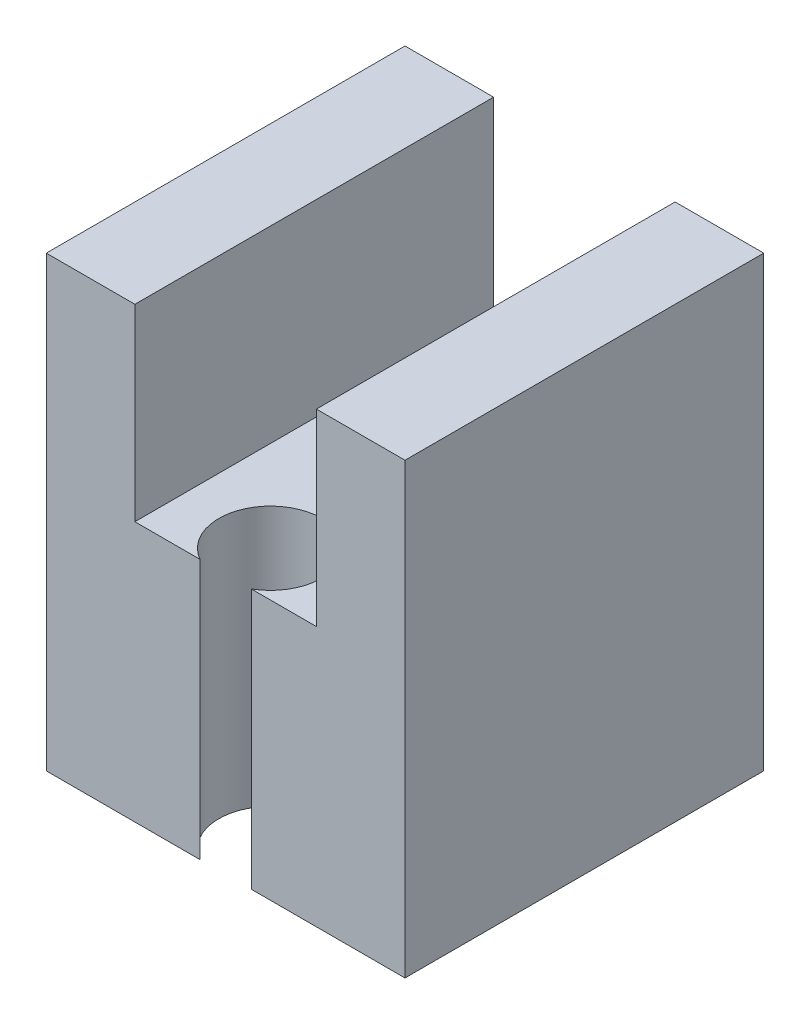
ISO-10303-21;
HEADER;
FILE_DESCRIPTION(('STEP AP214'),'2;1');
FILE_NAME('part.step','',(''),(''),'','','');
FILE_SCHEMA(('AUTOMOTIVE_DESIGN { 1 0 10303 214 1 1 1 1 }'));
ENDSEC;
DATA;
#1=APPLICATION_CONTEXT('core data for automotive mechanical design processes');
#2=APPLICATION_PROTOCOL_DEFINITION('international standard','automotive_design',2000,#1);
#3=PRODUCT_CONTEXT('',#1,'mechanical');
#4=PRODUCT('Part','Part','',(#3));
#5=PRODUCT_RELATED_PRODUCT_CATEGORY('part','',(#4));
#6=PRODUCT_DEFINITION_FORMATION('','',#4);
#7=PRODUCT_DEFINITION_CONTEXT('part definition',#1,'design');
#8=PRODUCT_DEFINITION('design','',#6,#7);
#9=PRODUCT_DEFINITION_SHAPE('','',#8);
#10=(LENGTH_UNIT() NAMED_UNIT(*) SI_UNIT(.MILLI.,.METRE.));
#11=(NAMED_UNIT(*) PLANE_ANGLE_UNIT() SI_UNIT($,.RADIAN.));
#12=(NAMED_UNIT(*) SI_UNIT($,.STERADIAN.) SOLID_ANGLE_UNIT());
#13=UNCERTAINTY_MEASURE_WITH_UNIT(LENGTH_MEASURE(1.E-05),#10,'distance_accuracy_value','');
#14=(GEOMETRIC_REPRESENTATION_CONTEXT(3) GLOBAL_UNCERTAINTY_ASSIGNED_CONTEXT((#13)) GLOBAL_UNIT_ASSIGNED_CONTEXT((#10,
#11,#12)) REPRESENTATION_CONTEXT('',''));
#15=CARTESIAN_POINT('',(0.,0.,0.));
#16=DIRECTION('',(0.,0.,1.));
#17=DIRECTION('',(1.,0.,0.));
#18=AXIS2_PLACEMENT_3D('',#15,#16,#17);
#19=CARTESIAN_POINT('',(0.,182.88,0.));
#20=DIRECTION('',(0.,1.,0.));
#21=DIRECTION('',(0.,0.,1.));
#22=AXIS2_PLACEMENT_3D('',#19,#20,#21);
#23=PLANE('',#22);
#24=DIRECTION('',(0.,0.,-1.));
#25=VECTOR('',#24,1.);
#26=CARTESIAN_POINT('',(-39.7129,182.88,-34.9885));
#27=LINE('',#26,#25);
#28=CARTESIAN_POINT('',(-39.7129,182.88,-34.9885));
#29=VERTEX_POINT('',#28);
#30=CARTESIAN_POINT('',(-39.7129,182.88,-47.6885));
#31=VERTEX_POINT('',#30);
#32=EDGE_CURVE('E140',#29,#31,#27,.T.);
#33=ORIENTED_EDGE('',*,*,#32,.F.);
#34=DIRECTION('',(1.,0.,0.));
#35=VECTOR('',#34,1.);
#36=CARTESIAN_POINT('',(-42.0180610207729,182.88,-34.9885));
#37=LINE('',#36,#35);
#38=CARTESIAN_POINT('',(-36.576,182.88,-34.9885));
#39=VERTEX_POINT('',#38);
#40=EDGE_CURVE('E234',#29,#39,#37,.T.);
#41=ORIENTED_EDGE('',*,*,#40,.T.);
#42=DIRECTION('',(0.,0.,-1.));
#43=VECTOR('',#42,1.);
#44=CARTESIAN_POINT('',(-36.576,182.88,-34.9885));
#45=LINE('',#44,#43);
#46=CARTESIAN_POINT('',(-36.576,182.88,-47.6885));
#47=VERTEX_POINT('',#46);
#48=EDGE_CURVE('E230',#39,#47,#45,.T.);
#49=ORIENTED_EDGE('',*,*,#48,.T.);
#50=DIRECTION('',(-1.,0.,0.));
#51=VECTOR('',#50,1.);
#52=CARTESIAN_POINT('',(-42.0180610207729,182.88,-47.6885));
#53=LINE('',#52,#51);
#54=EDGE_CURVE('E52',#47,#31,#53,.T.);
#55=ORIENTED_EDGE('',*,*,#54,.T.);
#56=EDGE_LOOP('',(#33,#41,#49,#55));
#57=FACE_BOUND('',#56,.T.);
#58=ADVANCED_FACE('F42',(#57),#23,.T.);
#59=CARTESIAN_POINT('',(-43.8339389792271,200.840512242138,-34.9885));
#60=DIRECTION('',(0.,0.,-1.));
#61=DIRECTION('',(-1.,0.,0.));
#62=AXIS2_PLACEMENT_3D('',#59,#60,#61);
#63=PLANE('',#62);
#64=DIRECTION('',(1.,0.,0.));
#65=VECTOR('',#64,1.);
#66=CARTESIAN_POINT('',(-46.1391,176.2125,-34.9885));
#67=LINE('',#66,#65);
#68=CARTESIAN_POINT('',(-46.1391,176.2125,-34.9885));
#69=VERTEX_POINT('',#68);
#70=CARTESIAN_POINT('',(-43.8339389792271,176.2125,-34.9885));
#71=VERTEX_POINT('',#70);
#72=EDGE_CURVE('E145',#69,#71,#67,.T.);
#73=ORIENTED_EDGE('',*,*,#72,.F.);
#74=DIRECTION('',(0.,1.,0.));
#75=VECTOR('',#74,1.);
#76=CARTESIAN_POINT('',(-46.1391,176.2125,-34.9885));
#77=LINE('',#76,#75);
#78=CARTESIAN_POINT('',(-46.1391,182.88,-34.9885));
#79=VERTEX_POINT('',#78);
#80=EDGE_CURVE('E179',#69,#79,#77,.T.);
#81=ORIENTED_EDGE('',*,*,#80,.T.);
#82=DIRECTION('',(1.,0.,0.));
#83=VECTOR('',#82,1.);
#84=CARTESIAN_POINT('',(-43.8339389792271,182.88,-34.9885));
#85=LINE('',#84,#83);
#86=CARTESIAN_POINT('',(-49.276,182.88,-34.9885));
#87=VERTEX_POINT('',#86);
#88=EDGE_CURVE('E237',#87,#79,#85,.T.);
#89=ORIENTED_EDGE('',*,*,#88,.F.);
#90=DIRECTION('',(0.,-1.,0.));
#91=VECTOR('',#90,1.);
#92=CARTESIAN_POINT('',(-49.276,200.840512242138,-34.9885));
#93=LINE('',#92,#91);
#94=CARTESIAN_POINT('',(-49.276,167.005,-34.9885));
#95=VERTEX_POINT('',#94);
#96=EDGE_CURVE('E46',#87,#95,#93,.T.);
#97=ORIENTED_EDGE('',*,*,#96,.T.);
#98=DIRECTION('',(1.,0.,0.));
#99=VECTOR('',#98,1.);
#100=CARTESIAN_POINT('',(-43.8339389792271,167.005,-34.9885));
#101=LINE('',#100,#99);
#102=CARTESIAN_POINT('',(-43.8339389792271,167.005,-34.9885));
#103=VERTEX_POINT('',#102);
#104=EDGE_CURVE('E224',#95,#103,#101,.T.);
#105=ORIENTED_EDGE('',*,*,#104,.T.);
#106=DIRECTION('',(0.,-1.,0.));
#107=VECTOR('',#106,1.);
#108=CARTESIAN_POINT('',(-43.8339389792271,200.840512242138,-34.9885));
#109=LINE('',#108,#107);
#110=EDGE_CURVE('E223',#71,#103,#109,.T.);
#111=ORIENTED_EDGE('',*,*,#110,.F.);
#112=EDGE_LOOP('',(#73,#81,#89,#97,#105,#111));
#113=FACE_BOUND('',#112,.T.);
#114=ADVANCED_FACE('F274',(#113),#63,.F.);
#115=CARTESIAN_POINT('',(-42.926,200.840512242138,-36.576));
#116=DIRECTION('',(0.,-1.,0.));
#117=DIRECTION('',(0.,0.,-1.));
#118=AXIS2_PLACEMENT_3D('',#115,#116,#117);
#119=CYLINDRICAL_SURFACE('',#118,1.8288);
#120=DIRECTION('',(0.,-1.,0.));
#121=VECTOR('',#120,1.);
#122=CARTESIAN_POINT('',(-42.0180610207729,200.840512242138,-34.9885));
#123=LINE('',#122,#121);
#124=CARTESIAN_POINT('',(-42.0180610207729,176.2125,-34.9885));
#125=VERTEX_POINT('',#124);
#126=CARTESIAN_POINT('',(-42.0180610207729,167.005,-34.9885));
#127=VERTEX_POINT('',#126);
#128=EDGE_CURVE('E218',#125,#127,#123,.T.);
#129=ORIENTED_EDGE('',*,*,#128,.F.);
#130=CARTESIAN_POINT('',(-42.926,176.2125,-36.576));
#131=DIRECTION('',(0.,-1.,0.));
#132=DIRECTION('',(0.,0.,-1.));
#133=AXIS2_PLACEMENT_3D('',#130,#131,#132);
#134=CIRCLE('',#133,1.8288);
#135=EDGE_CURVE('E187',#125,#71,#134,.F.);
#136=ORIENTED_EDGE('',*,*,#135,.T.);
#137=ORIENTED_EDGE('',*,*,#110,.T.);
#138=CARTESIAN_POINT('',(-42.926,167.005,-36.576));
#139=DIRECTION('',(0.,-1.,0.));
#140=DIRECTION('',(0.,0.,1.));
#141=AXIS2_PLACEMENT_3D('',#138,#139,#140);
#142=CIRCLE('',#141,1.8288);
#143=EDGE_CURVE('E219',#103,#127,#142,.T.);
#144=ORIENTED_EDGE('',*,*,#143,.T.);
#145=EDGE_LOOP('',(#129,#136,#137,#144));
#146=FACE_BOUND('',#145,.T.);
#147=ADVANCED_FACE('F292',(#146),#119,.F.);
#148=CARTESIAN_POINT('',(-42.0180610207729,200.840512242138,-34.9885));
#149=DIRECTION('',(0.,0.,-1.));
#150=DIRECTION('',(-1.,0.,0.));
#151=AXIS2_PLACEMENT_3D('',#148,#149,#150);
#152=PLANE('',#151);
#153=ORIENTED_EDGE('',*,*,#40,.F.);
#154=DIRECTION('',(0.,1.,0.));
#155=VECTOR('',#154,1.);
#156=CARTESIAN_POINT('',(-39.7129,176.2125,-34.9885));
#157=LINE('',#156,#155);
#158=CARTESIAN_POINT('',(-39.7129,176.2125,-34.9885));
#159=VERTEX_POINT('',#158);
#160=EDGE_CURVE('E175',#159,#29,#157,.T.);
#161=ORIENTED_EDGE('',*,*,#160,.F.);
#162=EDGE_CURVE('E152',#125,#159,#67,.T.);
#163=ORIENTED_EDGE('',*,*,#162,.F.);
#164=ORIENTED_EDGE('',*,*,#128,.T.);
#165=DIRECTION('',(1.,0.,0.));
#166=VECTOR('',#165,1.);
#167=CARTESIAN_POINT('',(-42.0180610207729,167.005,-34.9885));
#168=LINE('',#167,#166);
#169=CARTESIAN_POINT('',(-36.576,167.005,-34.9885));
#170=VERTEX_POINT('',#169);
#171=EDGE_CURVE('E214',#127,#170,#168,.T.);
#172=ORIENTED_EDGE('',*,*,#171,.T.);
#173=DIRECTION('',(0.,-1.,0.));
#174=VECTOR('',#173,1.);
#175=CARTESIAN_POINT('',(-36.576,200.840512242138,-34.9885));
#176=LINE('',#175,#174);
#177=EDGE_CURVE('E213',#39,#170,#176,.T.);
#178=ORIENTED_EDGE('',*,*,#177,.F.);
#179=EDGE_LOOP('',(#153,#161,#163,#164,#172,#178));
#180=FACE_BOUND('',#179,.T.);
#181=ADVANCED_FACE('F289',(#180),#152,.F.);
#182=CARTESIAN_POINT('',(-36.576,200.840512242138,-34.9885));
#183=DIRECTION('',(-1.,0.,0.));
#184=DIRECTION('',(0.,0.,1.));
#185=AXIS2_PLACEMENT_3D('',#182,#183,#184);
#186=PLANE('',#185);
#187=ORIENTED_EDGE('',*,*,#48,.F.);
#188=ORIENTED_EDGE('',*,*,#177,.T.);
#189=DIRECTION('',(0.,0.,-1.));
#190=VECTOR('',#189,1.);
#191=CARTESIAN_POINT('',(-36.576,167.005,-34.9885));
#192=LINE('',#191,#190);
#193=CARTESIAN_POINT('',(-36.576,167.005,-47.6885));
#194=VERTEX_POINT('',#193);
#195=EDGE_CURVE('E209',#170,#194,#192,.T.);
#196=ORIENTED_EDGE('',*,*,#195,.T.);
#197=DIRECTION('',(0.,-1.,0.));
#198=VECTOR('',#197,1.);
#199=CARTESIAN_POINT('',(-36.576,200.840512242138,-47.6885));
#200=LINE('',#199,#198);
#201=EDGE_CURVE('E208',#47,#194,#200,.T.);
#202=ORIENTED_EDGE('',*,*,#201,.F.);
#203=EDGE_LOOP('',(#187,#188,#196,#202));
#204=FACE_BOUND('',#203,.T.);
#205=ADVANCED_FACE('F285',(#204),#186,.F.);
#206=CARTESIAN_POINT('',(-42.0180610207729,200.840512242138,-47.6885));
#207=DIRECTION('',(0.,0.,1.));
#208=DIRECTION('',(1.,0.,0.));
#209=AXIS2_PLACEMENT_3D('',#206,#207,#208);
#210=PLANE('',#209);
#211=DIRECTION('',(-1.,0.,0.));
#212=VECTOR('',#211,1.);
#213=CARTESIAN_POINT('',(-46.1391,176.2125,-47.6885));
#214=LINE('',#213,#212);
#215=CARTESIAN_POINT('',(-39.7129,176.2125,-47.6885));
#216=VERTEX_POINT('',#215);
#217=CARTESIAN_POINT('',(-42.0180610207729,176.2125,-47.6885));
#218=VERTEX_POINT('',#217);
#219=EDGE_CURVE('E149',#216,#218,#214,.T.);
#220=ORIENTED_EDGE('',*,*,#219,.F.);
#221=DIRECTION('',(0.,1.,0.));
#222=VECTOR('',#221,1.);
#223=CARTESIAN_POINT('',(-39.7129,176.2125,-47.6885));
#224=LINE('',#223,#222);
#225=EDGE_CURVE('E134',#216,#31,#224,.T.);
#226=ORIENTED_EDGE('',*,*,#225,.T.);
#227=ORIENTED_EDGE('',*,*,#54,.F.);
#228=ORIENTED_EDGE('',*,*,#201,.T.);
#229=DIRECTION('',(-1.,0.,0.));
#230=VECTOR('',#229,1.);
#231=CARTESIAN_POINT('',(-42.0180610207729,167.005,-47.6885));
#232=LINE('',#231,#230);
#233=CARTESIAN_POINT('',(-42.0180610207729,167.005,-47.6885));
#234=VERTEX_POINT('',#233);
#235=EDGE_CURVE('E205',#194,#234,#232,.T.);
#236=ORIENTED_EDGE('',*,*,#235,.T.);
#237=DIRECTION('',(0.,-1.,0.));
#238=VECTOR('',#237,1.);
#239=CARTESIAN_POINT('',(-42.0180610207729,200.840512242138,-47.6885));
#240=LINE('',#239,#238);
#241=EDGE_CURVE('E160',#218,#234,#240,.T.);
#242=ORIENTED_EDGE('',*,*,#241,.F.);
#243=EDGE_LOOP('',(#220,#226,#227,#228,#236,#242));
#244=FACE_BOUND('',#243,.T.);
#245=ADVANCED_FACE('F158',(#244),#210,.F.);
#246=CARTESIAN_POINT('',(-42.926,200.840512242138,-46.101));
#247=DIRECTION('',(0.,-1.,0.));
#248=DIRECTION('',(0.,0.,-1.));
#249=AXIS2_PLACEMENT_3D('',#246,#247,#248);
#250=CYLINDRICAL_SURFACE('',#249,1.8288);
#251=DIRECTION('',(0.,-1.,0.));
#252=VECTOR('',#251,1.);
#253=CARTESIAN_POINT('',(-43.833938979227,200.840512242138,-47.6885));
#254=LINE('',#253,#252);
#255=CARTESIAN_POINT('',(-43.833938979227,176.2125,-47.6885));
#256=VERTEX_POINT('',#255);
#257=CARTESIAN_POINT('',(-43.833938979227,167.005,-47.6885));
#258=VERTEX_POINT('',#257);
#259=EDGE_CURVE('E200',#256,#258,#254,.T.);
#260=ORIENTED_EDGE('',*,*,#259,.F.);
#261=CARTESIAN_POINT('',(-42.926,176.2125,-46.101));
#262=DIRECTION('',(0.,-1.,0.));
#263=DIRECTION('',(0.,0.,-1.));
#264=AXIS2_PLACEMENT_3D('',#261,#262,#263);
#265=CIRCLE('',#264,1.8288);
#266=EDGE_CURVE('E178',#256,#218,#265,.F.);
#267=ORIENTED_EDGE('',*,*,#266,.T.);
#268=ORIENTED_EDGE('',*,*,#241,.T.);
#269=CARTESIAN_POINT('',(-42.926,167.005,-46.101));
#270=DIRECTION('',(0.,-1.,0.));
#271=DIRECTION('',(0.,0.,1.));
#272=AXIS2_PLACEMENT_3D('',#269,#270,#271);
#273=CIRCLE('',#272,1.8288);
#274=EDGE_CURVE('E201',#234,#258,#273,.T.);
#275=ORIENTED_EDGE('',*,*,#274,.T.);
#276=EDGE_LOOP('',(#260,#267,#268,#275));
#277=FACE_BOUND('',#276,.T.);
#278=ADVANCED_FACE('F279',(#277),#250,.F.);
#279=CARTESIAN_POINT('',(-43.833938979227,200.840512242138,-47.6885));
#280=DIRECTION('',(0.,0.,1.));
#281=DIRECTION('',(1.,0.,0.));
#282=AXIS2_PLACEMENT_3D('',#279,#280,#281);
#283=PLANE('',#282);
#284=DIRECTION('',(-1.,0.,0.));
#285=VECTOR('',#284,1.);
#286=CARTESIAN_POINT('',(-43.833938979227,182.88,-47.6885));
#287=LINE('',#286,#285);
#288=CARTESIAN_POINT('',(-46.1391,182.88,-47.6885));
#289=VERTEX_POINT('',#288);
#290=CARTESIAN_POINT('',(-49.276,182.88,-47.6885));
#291=VERTEX_POINT('',#290);
#292=EDGE_CURVE('E11',#289,#291,#287,.T.);
#293=ORIENTED_EDGE('',*,*,#292,.F.);
#294=DIRECTION('',(0.,1.,0.));
#295=VECTOR('',#294,1.);
#296=CARTESIAN_POINT('',(-46.1391,176.2125,-47.6885));
#297=LINE('',#296,#295);
#298=CARTESIAN_POINT('',(-46.1391,176.2125,-47.6885));
#299=VERTEX_POINT('',#298);
#300=EDGE_CURVE('E60',#299,#289,#297,.T.);
#301=ORIENTED_EDGE('',*,*,#300,.F.);
#302=EDGE_CURVE('E154',#256,#299,#214,.T.);
#303=ORIENTED_EDGE('',*,*,#302,.F.);
#304=ORIENTED_EDGE('',*,*,#259,.T.);
#305=DIRECTION('',(-1.,0.,0.));
#306=VECTOR('',#305,1.);
#307=CARTESIAN_POINT('',(-43.833938979227,167.005,-47.6885));
#308=LINE('',#307,#306);
#309=CARTESIAN_POINT('',(-49.276,167.005,-47.6885));
#310=VERTEX_POINT('',#309);
#311=EDGE_CURVE('E196',#258,#310,#308,.T.);
#312=ORIENTED_EDGE('',*,*,#311,.T.);
#313=DIRECTION('',(0.,-1.,0.));
#314=VECTOR('',#313,1.);
#315=CARTESIAN_POINT('',(-49.276,200.840512242138,-47.6885));
#316=LINE('',#315,#314);
#317=EDGE_CURVE('E195',#291,#310,#316,.T.);
#318=ORIENTED_EDGE('',*,*,#317,.F.);
#319=EDGE_LOOP('',(#293,#301,#303,#304,#312,#318));
#320=FACE_BOUND('',#319,.T.);
#321=ADVANCED_FACE('F263',(#320),#283,.F.);
#322=CARTESIAN_POINT('',(-49.276,200.840512242138,-34.9885));
#323=DIRECTION('',(1.,0.,0.));
#324=DIRECTION('',(0.,0.,-1.));
#325=AXIS2_PLACEMENT_3D('',#322,#323,#324);
#326=PLANE('',#325);
#327=DIRECTION('',(0.,0.,1.));
#328=VECTOR('',#327,1.);
#329=CARTESIAN_POINT('',(-49.276,182.88,-34.9885));
#330=LINE('',#329,#328);
#331=EDGE_CURVE('E194',#291,#87,#330,.T.);
#332=ORIENTED_EDGE('',*,*,#331,.F.);
#333=ORIENTED_EDGE('',*,*,#317,.T.);
#334=DIRECTION('',(0.,0.,1.));
#335=VECTOR('',#334,1.);
#336=CARTESIAN_POINT('',(-49.276,167.005,-34.9885));
#337=LINE('',#336,#335);
#338=EDGE_CURVE('E191',#310,#95,#337,.T.);
#339=ORIENTED_EDGE('',*,*,#338,.T.);
#340=ORIENTED_EDGE('',*,*,#96,.F.);
#341=EDGE_LOOP('',(#332,#333,#339,#340));
#342=FACE_BOUND('',#341,.T.);
#343=ADVANCED_FACE('F257',(#342),#326,.F.);
#344=CARTESIAN_POINT('',(-42.926,167.005,-46.101));
#345=DIRECTION('',(0.,1.,0.));
#346=DIRECTION('',(0.,0.,1.));
#347=AXIS2_PLACEMENT_3D('',#344,#345,#346);
#348=PLANE('',#347);
#349=ORIENTED_EDGE('',*,*,#104,.F.);
#350=ORIENTED_EDGE('',*,*,#338,.F.);
#351=ORIENTED_EDGE('',*,*,#311,.F.);
#352=ORIENTED_EDGE('',*,*,#274,.F.);
#353=ORIENTED_EDGE('',*,*,#235,.F.);
#354=ORIENTED_EDGE('',*,*,#195,.F.);
#355=ORIENTED_EDGE('',*,*,#171,.F.);
#356=ORIENTED_EDGE('',*,*,#143,.F.);
#357=EDGE_LOOP('',(#349,#350,#351,#352,#353,#354,#355,#356));
#358=FACE_BOUND('',#357,.T.);
#359=ADVANCED_FACE('F268',(#358),#348,.F.);
#360=DIRECTION('',(0.,0.,1.));
#361=VECTOR('',#360,1.);
#362=CARTESIAN_POINT('',(-46.1391,182.88,-34.9885));
#363=LINE('',#362,#361);
#364=EDGE_CURVE('E155',#289,#79,#363,.T.);
#365=ORIENTED_EDGE('',*,*,#364,.F.);
#366=ORIENTED_EDGE('',*,*,#292,.T.);
#367=ORIENTED_EDGE('',*,*,#331,.T.);
#368=ORIENTED_EDGE('',*,*,#88,.T.);
#369=EDGE_LOOP('',(#365,#366,#367,#368));
#370=FACE_BOUND('',#369,.T.);
#371=ADVANCED_FACE('F44',(#370),#23,.T.);
#372=CARTESIAN_POINT('',(0.,176.2125,0.));
#373=DIRECTION('',(0.,-1.,0.));
#374=DIRECTION('',(0.,0.,-1.));
#375=AXIS2_PLACEMENT_3D('',#372,#373,#374);
#376=PLANE('',#375);
#377=ORIENTED_EDGE('',*,*,#162,.T.);
#378=DIRECTION('',(0.,0.,-1.));
#379=VECTOR('',#378,1.);
#380=CARTESIAN_POINT('',(-39.7129,176.2125,-34.9885));
#381=LINE('',#380,#379);
#382=EDGE_CURVE('E137',#159,#216,#381,.T.);
#383=ORIENTED_EDGE('',*,*,#382,.T.);
#384=ORIENTED_EDGE('',*,*,#219,.T.);
#385=ORIENTED_EDGE('',*,*,#266,.F.);
#386=ORIENTED_EDGE('',*,*,#302,.T.);
#387=DIRECTION('',(0.,0.,1.));
#388=VECTOR('',#387,1.);
#389=CARTESIAN_POINT('',(-46.1391,176.2125,-34.9885));
#390=LINE('',#389,#388);
#391=EDGE_CURVE('E162',#299,#69,#390,.T.);
#392=ORIENTED_EDGE('',*,*,#391,.T.);
#393=ORIENTED_EDGE('',*,*,#72,.T.);
#394=ORIENTED_EDGE('',*,*,#135,.F.);
#395=EDGE_LOOP('',(#377,#383,#384,#385,#386,#392,#393,#394));
#396=FACE_BOUND('',#395,.T.);
#397=ADVANCED_FACE('F148',(#396),#376,.F.);
#398=CARTESIAN_POINT('',(-39.7129,176.2125,-34.9885));
#399=DIRECTION('',(1.,0.,0.));
#400=DIRECTION('',(0.,0.,-1.));
#401=AXIS2_PLACEMENT_3D('',#398,#399,#400);
#402=PLANE('',#401);
#403=ORIENTED_EDGE('',*,*,#32,.T.);
#404=ORIENTED_EDGE('',*,*,#225,.F.);
#405=ORIENTED_EDGE('',*,*,#382,.F.);
#406=ORIENTED_EDGE('',*,*,#160,.T.);
#407=EDGE_LOOP('',(#403,#404,#405,#406));
#408=FACE_BOUND('',#407,.T.);
#409=ADVANCED_FACE('F136',(#408),#402,.F.);
#410=CARTESIAN_POINT('',(-46.1391,176.2125,-34.9885));
#411=DIRECTION('',(-1.,0.,0.));
#412=DIRECTION('',(0.,0.,1.));
#413=AXIS2_PLACEMENT_3D('',#410,#411,#412);
#414=PLANE('',#413);
#415=ORIENTED_EDGE('',*,*,#364,.T.);
#416=ORIENTED_EDGE('',*,*,#80,.F.);
#417=ORIENTED_EDGE('',*,*,#391,.F.);
#418=ORIENTED_EDGE('',*,*,#300,.T.);
#419=EDGE_LOOP('',(#415,#416,#417,#418));
#420=FACE_BOUND('',#419,.T.);
#421=ADVANCED_FACE('F293',(#420),#414,.F.);
#422=CLOSED_SHELL('',(#58,#114,#147,#181,#205,#245,#278,#321,#343,#359,#371,#397,#409,#421));
#423=MANIFOLD_SOLID_BREP('B2',#422);
#424=ADVANCED_BREP_SHAPE_REPRESENTATION('',(#18,#423),#14);
#425=SHAPE_DEFINITION_REPRESENTATION(#9,#424);
ENDSEC;
END-ISO-10303-21;
